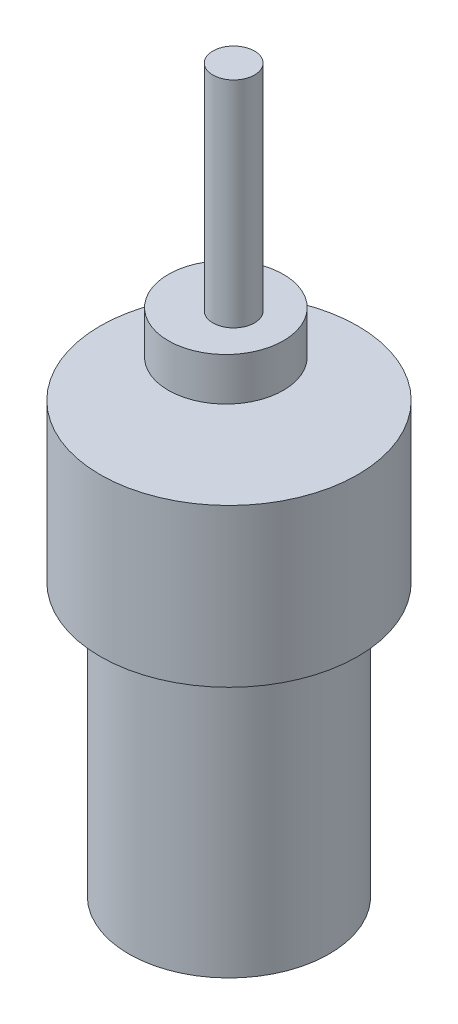
ISO-10303-21;
HEADER;
FILE_DESCRIPTION(('STEP AP214'),'2;1');
FILE_NAME('part.step','',(''),(''),'','','');
FILE_SCHEMA(('AUTOMOTIVE_DESIGN { 1 0 10303 214 1 1 1 1 }'));
ENDSEC;
DATA;
#1=APPLICATION_CONTEXT('core data for automotive mechanical design processes');
#2=APPLICATION_PROTOCOL_DEFINITION('international standard','automotive_design',2000,#1);
#3=PRODUCT_CONTEXT('',#1,'mechanical');
#4=PRODUCT('Part','Part','',(#3));
#5=PRODUCT_RELATED_PRODUCT_CATEGORY('part','',(#4));
#6=PRODUCT_DEFINITION_FORMATION('','',#4);
#7=PRODUCT_DEFINITION_CONTEXT('part definition',#1,'design');
#8=PRODUCT_DEFINITION('design','',#6,#7);
#9=PRODUCT_DEFINITION_SHAPE('','',#8);
#10=(LENGTH_UNIT() NAMED_UNIT(*) SI_UNIT(.MILLI.,.METRE.));
#11=(NAMED_UNIT(*) PLANE_ANGLE_UNIT() SI_UNIT($,.RADIAN.));
#12=(NAMED_UNIT(*) SI_UNIT($,.STERADIAN.) SOLID_ANGLE_UNIT());
#13=UNCERTAINTY_MEASURE_WITH_UNIT(LENGTH_MEASURE(1.E-05),#10,'distance_accuracy_value','');
#14=(GEOMETRIC_REPRESENTATION_CONTEXT(3) GLOBAL_UNCERTAINTY_ASSIGNED_CONTEXT((#13)) GLOBAL_UNIT_ASSIGNED_CONTEXT((#10,
#11,#12)) REPRESENTATION_CONTEXT('',''));
#15=CARTESIAN_POINT('',(0.,0.,0.));
#16=DIRECTION('',(0.,0.,1.));
#17=DIRECTION('',(1.,0.,0.));
#18=AXIS2_PLACEMENT_3D('',#15,#16,#17);
#19=CARTESIAN_POINT('',(0.,38.,0.));
#20=DIRECTION('',(0.,-1.,0.));
#21=DIRECTION('',(0.,0.,-1.));
#22=AXIS2_PLACEMENT_3D('',#19,#20,#21);
#23=CYLINDRICAL_SURFACE('',#22,14.);
#24=CARTESIAN_POINT('',(0.,38.,0.));
#25=DIRECTION('',(0.,1.,0.));
#26=DIRECTION('',(0.,0.,1.));
#27=AXIS2_PLACEMENT_3D('',#24,#25,#26);
#28=CIRCLE('',#27,14.);
#29=CARTESIAN_POINT('',(0.,38.,14.));
#30=VERTEX_POINT('',#29);
#31=EDGE_CURVE('E51',#30,#30,#28,.T.);
#32=ORIENTED_EDGE('',*,*,#31,.F.);
#33=EDGE_LOOP('',(#32));
#34=FACE_BOUND('',#33,.T.);
#35=CARTESIAN_POINT('',(0.,0.,0.));
#36=DIRECTION('',(0.,1.,0.));
#37=DIRECTION('',(0.,0.,1.));
#38=AXIS2_PLACEMENT_3D('',#35,#36,#37);
#39=CIRCLE('',#38,14.);
#40=CARTESIAN_POINT('',(0.,0.,14.));
#41=VERTEX_POINT('',#40);
#42=EDGE_CURVE('E40',#41,#41,#39,.T.);
#43=ORIENTED_EDGE('',*,*,#42,.T.);
#44=EDGE_LOOP('',(#43));
#45=FACE_BOUND('',#44,.T.);
#46=ADVANCED_FACE('F37',(#34,#45),#23,.T.);
#47=CARTESIAN_POINT('',(0.,0.,0.));
#48=DIRECTION('',(0.,1.,0.));
#49=DIRECTION('',(0.,0.,1.));
#50=AXIS2_PLACEMENT_3D('',#47,#48,#49);
#51=PLANE('',#50);
#52=ORIENTED_EDGE('',*,*,#42,.F.);
#53=EDGE_LOOP('',(#52));
#54=FACE_BOUND('',#53,.T.);
#55=ADVANCED_FACE('F76',(#54),#51,.F.);
#56=CARTESIAN_POINT('',(0.,60.,0.));
#57=DIRECTION('',(0.,-1.,0.));
#58=DIRECTION('',(0.,0.,-1.));
#59=AXIS2_PLACEMENT_3D('',#56,#57,#58);
#60=CYLINDRICAL_SURFACE('',#59,18.);
#61=CARTESIAN_POINT('',(0.,60.,0.));
#62=DIRECTION('',(0.,1.,0.));
#63=DIRECTION('',(0.,0.,1.));
#64=AXIS2_PLACEMENT_3D('',#61,#62,#63);
#65=CIRCLE('',#64,18.);
#66=CARTESIAN_POINT('',(0.,60.,18.));
#67=VERTEX_POINT('',#66);
#68=EDGE_CURVE('E61',#67,#67,#65,.T.);
#69=ORIENTED_EDGE('',*,*,#68,.F.);
#70=EDGE_LOOP('',(#69));
#71=FACE_BOUND('',#70,.T.);
#72=CARTESIAN_POINT('',(0.,38.,0.));
#73=DIRECTION('',(0.,1.,0.));
#74=DIRECTION('',(0.,0.,1.));
#75=AXIS2_PLACEMENT_3D('',#72,#73,#74);
#76=CIRCLE('',#75,18.);
#77=CARTESIAN_POINT('',(0.,38.,18.));
#78=VERTEX_POINT('',#77);
#79=EDGE_CURVE('E59',#78,#78,#76,.T.);
#80=ORIENTED_EDGE('',*,*,#79,.T.);
#81=EDGE_LOOP('',(#80));
#82=FACE_BOUND('',#81,.T.);
#83=ADVANCED_FACE('F78',(#71,#82),#60,.T.);
#84=CARTESIAN_POINT('',(0.,60.,0.));
#85=DIRECTION('',(0.,1.,0.));
#86=DIRECTION('',(0.,0.,1.));
#87=AXIS2_PLACEMENT_3D('',#84,#85,#86);
#88=PLANE('',#87);
#89=CARTESIAN_POINT('',(-5.44016536073855,60.,-5.00287921639142));
#90=DIRECTION('',(0.,1.,0.));
#91=DIRECTION('',(0.,0.,1.));
#92=AXIS2_PLACEMENT_3D('',#89,#90,#91);
#93=CIRCLE('',#92,8.03806556986515);
#94=CARTESIAN_POINT('',(-5.44016536073855,60.,3.03518635347373));
#95=VERTEX_POINT('',#94);
#96=EDGE_CURVE('E45',#95,#95,#93,.T.);
#97=ORIENTED_EDGE('',*,*,#96,.F.);
#98=EDGE_LOOP('',(#97));
#99=FACE_BOUND('',#98,.T.);
#100=ORIENTED_EDGE('',*,*,#68,.T.);
#101=EDGE_LOOP('',(#100));
#102=FACE_BOUND('',#101,.T.);
#103=ADVANCED_FACE('F83',(#99,#102),#88,.T.);
#104=CARTESIAN_POINT('',(0.,38.,0.));
#105=DIRECTION('',(0.,1.,0.));
#106=DIRECTION('',(0.,0.,1.));
#107=AXIS2_PLACEMENT_3D('',#104,#105,#106);
#108=PLANE('',#107);
#109=ORIENTED_EDGE('',*,*,#31,.T.);
#110=EDGE_LOOP('',(#109));
#111=FACE_BOUND('',#110,.T.);
#112=ORIENTED_EDGE('',*,*,#79,.F.);
#113=EDGE_LOOP('',(#112));
#114=FACE_BOUND('',#113,.T.);
#115=ADVANCED_FACE('F88',(#111,#114),#108,.F.);
#116=CARTESIAN_POINT('',(-5.44016536073855,66.,-5.00287921639142));
#117=DIRECTION('',(0.,-1.,0.));
#118=DIRECTION('',(0.,0.,-1.));
#119=AXIS2_PLACEMENT_3D('',#116,#117,#118);
#120=CYLINDRICAL_SURFACE('',#119,8.03806556986515);
#121=CARTESIAN_POINT('',(-5.44016536073855,66.,-5.00287921639142));
#122=DIRECTION('',(0.,1.,0.));
#123=DIRECTION('',(0.,0.,1.));
#124=AXIS2_PLACEMENT_3D('',#121,#122,#123);
#125=CIRCLE('',#124,8.03806556986515);
#126=CARTESIAN_POINT('',(-5.44016536073855,66.,3.03518635347373));
#127=VERTEX_POINT('',#126);
#128=EDGE_CURVE('E56',#127,#127,#125,.T.);
#129=ORIENTED_EDGE('',*,*,#128,.F.);
#130=EDGE_LOOP('',(#129));
#131=FACE_BOUND('',#130,.T.);
#132=ORIENTED_EDGE('',*,*,#96,.T.);
#133=EDGE_LOOP('',(#132));
#134=FACE_BOUND('',#133,.T.);
#135=ADVANCED_FACE('F91',(#131,#134),#120,.T.);
#136=CARTESIAN_POINT('',(-5.44016536073855,66.,-5.00287921639142));
#137=DIRECTION('',(0.,1.,0.));
#138=DIRECTION('',(0.,0.,1.));
#139=AXIS2_PLACEMENT_3D('',#136,#137,#138);
#140=PLANE('',#139);
#141=CARTESIAN_POINT('',(-4.4841537683169,66.,-5.13883488056877));
#142=DIRECTION('',(0.,1.,0.));
#143=DIRECTION('',(0.,0.,1.));
#144=AXIS2_PLACEMENT_3D('',#141,#142,#143);
#145=CIRCLE('',#144,2.90759192677115);
#146=CARTESIAN_POINT('',(-4.4841537683169,66.,-2.23124295379762));
#147=VERTEX_POINT('',#146);
#148=EDGE_CURVE('E10',#147,#147,#145,.T.);
#149=ORIENTED_EDGE('',*,*,#148,.F.);
#150=EDGE_LOOP('',(#149));
#151=FACE_BOUND('',#150,.T.);
#152=ORIENTED_EDGE('',*,*,#128,.T.);
#153=EDGE_LOOP('',(#152));
#154=FACE_BOUND('',#153,.T.);
#155=ADVANCED_FACE('F97',(#151,#154),#140,.T.);
#156=CARTESIAN_POINT('',(-4.4841537683169,96.,-5.13883488056877));
#157=DIRECTION('',(0.,-1.,0.));
#158=DIRECTION('',(0.,0.,-1.));
#159=AXIS2_PLACEMENT_3D('',#156,#157,#158);
#160=CYLINDRICAL_SURFACE('',#159,2.90759192677115);
#161=CARTESIAN_POINT('',(-4.4841537683169,96.,-5.13883488056877));
#162=DIRECTION('',(0.,1.,0.));
#163=DIRECTION('',(0.,0.,1.));
#164=AXIS2_PLACEMENT_3D('',#161,#162,#163);
#165=CIRCLE('',#164,2.90759192677115);
#166=CARTESIAN_POINT('',(-4.4841537683169,96.,-2.23124295379762));
#167=VERTEX_POINT('',#166);
#168=EDGE_CURVE('E55',#167,#167,#165,.T.);
#169=ORIENTED_EDGE('',*,*,#168,.F.);
#170=EDGE_LOOP('',(#169));
#171=FACE_BOUND('',#170,.T.);
#172=ORIENTED_EDGE('',*,*,#148,.T.);
#173=EDGE_LOOP('',(#172));
#174=FACE_BOUND('',#173,.T.);
#175=ADVANCED_FACE('F101',(#171,#174),#160,.T.);
#176=CARTESIAN_POINT('',(-4.4841537683169,96.,-5.13883488056877));
#177=DIRECTION('',(0.,1.,0.));
#178=DIRECTION('',(0.,0.,1.));
#179=AXIS2_PLACEMENT_3D('',#176,#177,#178);
#180=PLANE('',#179);
#181=ORIENTED_EDGE('',*,*,#168,.T.);
#182=EDGE_LOOP('',(#181));
#183=FACE_BOUND('',#182,.T.);
#184=ADVANCED_FACE('F105',(#183),#180,.T.);
#185=CLOSED_SHELL('',(#46,#55,#83,#103,#115,#135,#155,#175,#184));
#186=MANIFOLD_SOLID_BREP('B2',#185);
#187=ADVANCED_BREP_SHAPE_REPRESENTATION('',(#18,#186),#14);
#188=SHAPE_DEFINITION_REPRESENTATION(#9,#187);
ENDSEC;
END-ISO-10303-21;
